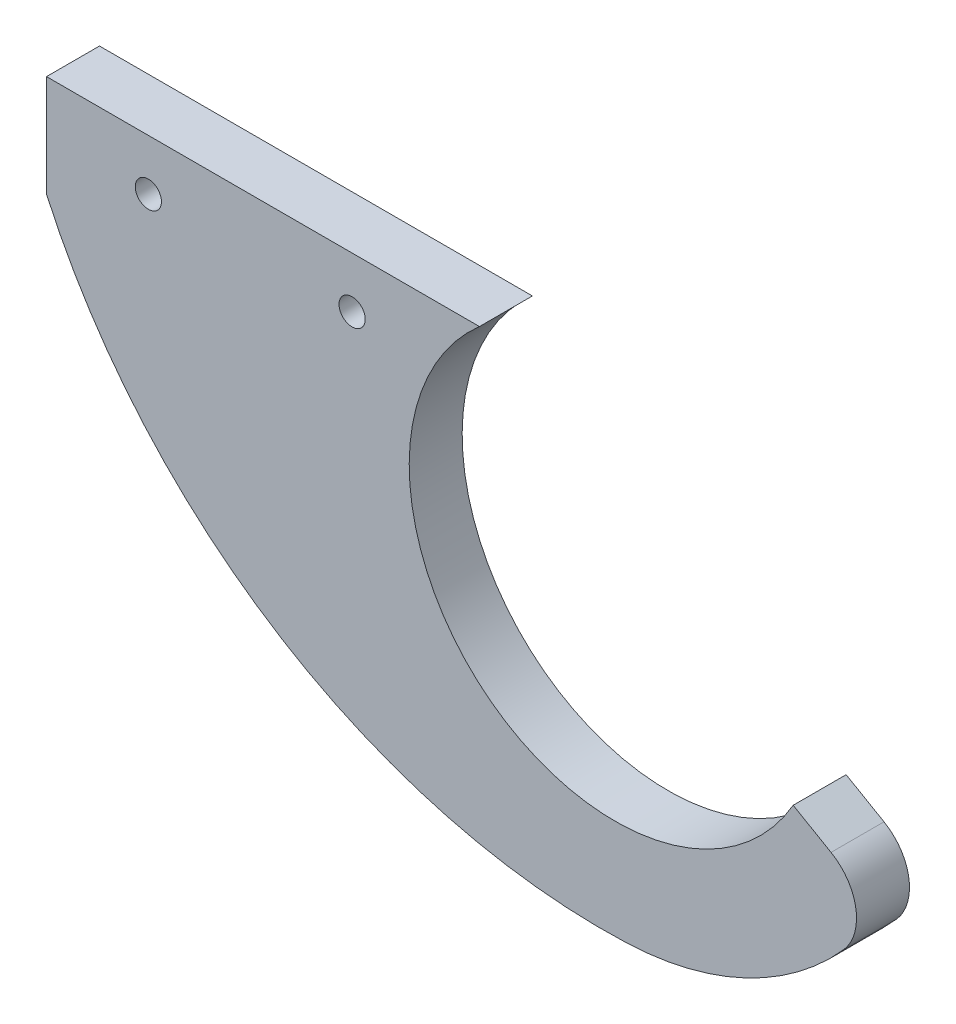
ISO-10303-21;
HEADER;
FILE_DESCRIPTION(('STEP AP214'),'2;1');
FILE_NAME('part.step','',(''),(''),'','','');
FILE_SCHEMA(('AUTOMOTIVE_DESIGN { 1 0 10303 214 1 1 1 1 }'));
ENDSEC;
DATA;
#1=APPLICATION_CONTEXT('core data for automotive mechanical design processes');
#2=APPLICATION_PROTOCOL_DEFINITION('international standard','automotive_design',2000,#1);
#3=PRODUCT_CONTEXT('',#1,'mechanical');
#4=PRODUCT('Part','Part','',(#3));
#5=PRODUCT_RELATED_PRODUCT_CATEGORY('part','',(#4));
#6=PRODUCT_DEFINITION_FORMATION('','',#4);
#7=PRODUCT_DEFINITION_CONTEXT('part definition',#1,'design');
#8=PRODUCT_DEFINITION('design','',#6,#7);
#9=PRODUCT_DEFINITION_SHAPE('','',#8);
#10=(LENGTH_UNIT() NAMED_UNIT(*) SI_UNIT(.MILLI.,.METRE.));
#11=(NAMED_UNIT(*) PLANE_ANGLE_UNIT() SI_UNIT($,.RADIAN.));
#12=(NAMED_UNIT(*) SI_UNIT($,.STERADIAN.) SOLID_ANGLE_UNIT());
#13=UNCERTAINTY_MEASURE_WITH_UNIT(LENGTH_MEASURE(1.E-05),#10,'distance_accuracy_value','');
#14=(GEOMETRIC_REPRESENTATION_CONTEXT(3) GLOBAL_UNCERTAINTY_ASSIGNED_CONTEXT((#13)) GLOBAL_UNIT_ASSIGNED_CONTEXT((#10,
#11,#12)) REPRESENTATION_CONTEXT('',''));
#15=CARTESIAN_POINT('',(0.,0.,0.));
#16=DIRECTION('',(0.,0.,1.));
#17=DIRECTION('',(1.,0.,0.));
#18=AXIS2_PLACEMENT_3D('',#15,#16,#17);
#19=CARTESIAN_POINT('',(-53.975,0.,6.604));
#20=DIRECTION('',(1.,0.,0.));
#21=DIRECTION('',(0.,0.,-1.));
#22=AXIS2_PLACEMENT_3D('',#19,#20,#21);
#23=PLANE('',#22);
#24=DIRECTION('',(0.,-1.,0.));
#25=VECTOR('',#24,1.);
#26=CARTESIAN_POINT('',(-53.975,0.,0.));
#27=LINE('',#26,#25);
#28=CARTESIAN_POINT('',(-53.975,-5.08,0.));
#29=VERTEX_POINT('',#28);
#30=CARTESIAN_POINT('',(-53.975,-17.78,0.));
#31=VERTEX_POINT('',#30);
#32=EDGE_CURVE('E118',#29,#31,#27,.T.);
#33=ORIENTED_EDGE('',*,*,#32,.T.);
#34=DIRECTION('',(0.,0.,-1.));
#35=VECTOR('',#34,1.);
#36=CARTESIAN_POINT('',(-53.975,-17.78,6.604));
#37=LINE('',#36,#35);
#38=CARTESIAN_POINT('',(-53.975,-17.78,6.604));
#39=VERTEX_POINT('',#38);
#40=EDGE_CURVE('E101',#39,#31,#37,.T.);
#41=ORIENTED_EDGE('',*,*,#40,.F.);
#42=DIRECTION('',(0.,-1.,0.));
#43=VECTOR('',#42,1.);
#44=CARTESIAN_POINT('',(-53.975,0.,6.604));
#45=LINE('',#44,#43);
#46=CARTESIAN_POINT('',(-53.975,-5.08,6.604));
#47=VERTEX_POINT('',#46);
#48=EDGE_CURVE('E107',#47,#39,#45,.T.);
#49=ORIENTED_EDGE('',*,*,#48,.F.);
#50=DIRECTION('',(0.,0.,-1.));
#51=VECTOR('',#50,1.);
#52=CARTESIAN_POINT('',(-53.975,-5.08,6.604));
#53=LINE('',#52,#51);
#54=EDGE_CURVE('E131',#47,#29,#53,.T.);
#55=ORIENTED_EDGE('',*,*,#54,.T.);
#56=EDGE_LOOP('',(#33,#41,#49,#55));
#57=FACE_BOUND('',#56,.T.);
#58=ADVANCED_FACE('F37',(#57),#23,.F.);
#59=CARTESIAN_POINT('',(15.4240882366703,13.6875475993736,6.604));
#60=DIRECTION('',(0.,0.,-1.));
#61=DIRECTION('',(-1.,0.,0.));
#62=AXIS2_PLACEMENT_3D('',#59,#60,#61);
#63=CYLINDRICAL_SURFACE('',#62,76.2);
#64=CARTESIAN_POINT('',(15.4240882366703,13.6875475993736,0.));
#65=DIRECTION('',(0.,0.,1.));
#66=DIRECTION('',(1.,0.,0.));
#67=AXIS2_PLACEMENT_3D('',#64,#65,#66);
#68=CIRCLE('',#67,76.2);
#69=CARTESIAN_POINT('',(18.3684138902809,-62.4555475993736,0.));
#70=VERTEX_POINT('',#69);
#71=EDGE_CURVE('E142',#31,#70,#68,.T.);
#72=ORIENTED_EDGE('',*,*,#71,.T.);
#73=DIRECTION('',(0.,0.,-1.));
#74=VECTOR('',#73,1.);
#75=CARTESIAN_POINT('',(18.3684138902809,-62.4555475993736,6.604));
#76=LINE('',#75,#74);
#77=CARTESIAN_POINT('',(18.3684138902809,-62.4555475993736,6.604));
#78=VERTEX_POINT('',#77);
#79=EDGE_CURVE('E104',#78,#70,#76,.T.);
#80=ORIENTED_EDGE('',*,*,#79,.F.);
#81=CARTESIAN_POINT('',(15.4240882366703,13.6875475993736,6.604));
#82=DIRECTION('',(0.,0.,1.));
#83=DIRECTION('',(1.,0.,0.));
#84=AXIS2_PLACEMENT_3D('',#81,#82,#83);
#85=CIRCLE('',#84,76.2);
#86=EDGE_CURVE('E96',#39,#78,#85,.T.);
#87=ORIENTED_EDGE('',*,*,#86,.F.);
#88=ORIENTED_EDGE('',*,*,#40,.T.);
#89=EDGE_LOOP('',(#72,#80,#87,#88));
#90=FACE_BOUND('',#89,.T.);
#91=ADVANCED_FACE('F99',(#90),#63,.T.);
#92=CARTESIAN_POINT('',(16.8962510634756,-24.384,6.604));
#93=DIRECTION('',(0.,0.,-1.));
#94=DIRECTION('',(-1.,0.,0.));
#95=AXIS2_PLACEMENT_3D('',#92,#93,#94);
#96=CYLINDRICAL_SURFACE('',#95,38.1);
#97=CARTESIAN_POINT('',(16.8962510634756,-24.384,0.));
#98=DIRECTION('',(0.,0.,1.));
#99=DIRECTION('',(1.,0.,0.));
#100=AXIS2_PLACEMENT_3D('',#97,#98,#99);
#101=CIRCLE('',#100,38.1);
#102=CARTESIAN_POINT('',(45.4151730993247,-49.6482254168451,0.));
#103=VERTEX_POINT('',#102);
#104=EDGE_CURVE('E140',#103,#70,#101,.F.);
#105=ORIENTED_EDGE('',*,*,#104,.F.);
#106=DIRECTION('',(0.,0.,-1.));
#107=VECTOR('',#106,1.);
#108=CARTESIAN_POINT('',(45.4151730993247,-49.6482254168451,6.604));
#109=LINE('',#108,#107);
#110=CARTESIAN_POINT('',(45.4151730993247,-49.6482254168451,6.604));
#111=VERTEX_POINT('',#110);
#112=EDGE_CURVE('E46',#103,#111,#109,.F.);
#113=ORIENTED_EDGE('',*,*,#112,.T.);
#114=CARTESIAN_POINT('',(16.8962510634756,-24.384,6.604));
#115=DIRECTION('',(0.,0.,1.));
#116=DIRECTION('',(1.,0.,0.));
#117=AXIS2_PLACEMENT_3D('',#114,#115,#116);
#118=CIRCLE('',#117,38.1);
#119=EDGE_CURVE('E106',#111,#78,#118,.F.);
#120=ORIENTED_EDGE('',*,*,#119,.T.);
#121=ORIENTED_EDGE('',*,*,#79,.T.);
#122=EDGE_LOOP('',(#105,#113,#120,#121));
#123=FACE_BOUND('',#122,.T.);
#124=ADVANCED_FACE('F191',(#123),#96,.T.);
#125=CARTESIAN_POINT('',(-6.334518957071,-10.9717086751553,6.604));
#126=DIRECTION('',(0.499999999999994,0.866025403784442,0.));
#127=DIRECTION('',(-0.866025403784442,0.499999999999994,0.));
#128=AXIS2_PLACEMENT_3D('',#125,#126,#127);
#129=PLANE('',#128);
#130=DIRECTION('',(0.866025403784442,-0.499999999999994,0.));
#131=VECTOR('',#130,1.);
#132=CARTESIAN_POINT('',(-6.334518957071,-10.9717086751553,6.604));
#133=LINE('',#132,#131);
#134=CARTESIAN_POINT('',(39.1132667721617,-37.2109999999999,6.604));
#135=VERTEX_POINT('',#134);
#136=CARTESIAN_POINT('',(43.8370194266831,-39.938259866673,6.604));
#137=VERTEX_POINT('',#136);
#138=EDGE_CURVE('E148',#135,#137,#133,.T.);
#139=ORIENTED_EDGE('',*,*,#138,.T.);
#140=DIRECTION('',(0.,0.,-1.));
#141=VECTOR('',#140,1.);
#142=CARTESIAN_POINT('',(43.8370194266831,-39.938259866673,6.604));
#143=LINE('',#142,#141);
#144=CARTESIAN_POINT('',(43.8370194266831,-39.938259866673,0.));
#145=VERTEX_POINT('',#144);
#146=EDGE_CURVE('E119',#137,#145,#143,.T.);
#147=ORIENTED_EDGE('',*,*,#146,.T.);
#148=DIRECTION('',(0.866025403784442,-0.499999999999994,0.));
#149=VECTOR('',#148,1.);
#150=CARTESIAN_POINT('',(-6.334518957071,-10.9717086751553,0.));
#151=LINE('',#150,#149);
#152=CARTESIAN_POINT('',(39.1132667721617,-37.2109999999999,0.));
#153=VERTEX_POINT('',#152);
#154=EDGE_CURVE('E138',#153,#145,#151,.T.);
#155=ORIENTED_EDGE('',*,*,#154,.F.);
#156=DIRECTION('',(0.,0.,-1.));
#157=VECTOR('',#156,1.);
#158=CARTESIAN_POINT('',(39.1132667721617,-37.2109999999999,6.604));
#159=LINE('',#158,#157);
#160=EDGE_CURVE('E123',#135,#153,#159,.T.);
#161=ORIENTED_EDGE('',*,*,#160,.F.);
#162=EDGE_LOOP('',(#139,#147,#155,#161));
#163=FACE_BOUND('',#162,.T.);
#164=ADVANCED_FACE('F185',(#163),#129,.T.);
#165=CARTESIAN_POINT('',(16.8962510634756,-24.384,6.604));
#166=DIRECTION('',(0.,0.,-1.));
#167=DIRECTION('',(-1.,0.,0.));
#168=AXIS2_PLACEMENT_3D('',#165,#166,#167);
#169=CYLINDRICAL_SURFACE('',#168,25.654);
#170=CARTESIAN_POINT('',(16.8962510634756,-24.384,0.));
#171=DIRECTION('',(0.,0.,1.));
#172=DIRECTION('',(1.,0.,0.));
#173=AXIS2_PLACEMENT_3D('',#170,#171,#172);
#174=CIRCLE('',#173,25.654);
#175=CARTESIAN_POINT('',(0.,-5.08,0.));
#176=VERTEX_POINT('',#175);
#177=EDGE_CURVE('E135',#153,#176,#174,.F.);
#178=ORIENTED_EDGE('',*,*,#177,.T.);
#179=DIRECTION('',(0.,0.,-1.));
#180=VECTOR('',#179,1.);
#181=CARTESIAN_POINT('',(0.,-5.08,6.604));
#182=LINE('',#181,#180);
#183=CARTESIAN_POINT('',(0.,-5.08,6.604));
#184=VERTEX_POINT('',#183);
#185=EDGE_CURVE('E129',#184,#176,#182,.T.);
#186=ORIENTED_EDGE('',*,*,#185,.F.);
#187=CARTESIAN_POINT('',(16.8962510634756,-24.384,6.604));
#188=DIRECTION('',(0.,0.,1.));
#189=DIRECTION('',(1.,0.,0.));
#190=AXIS2_PLACEMENT_3D('',#187,#188,#189);
#191=CIRCLE('',#190,25.654);
#192=EDGE_CURVE('E146',#135,#184,#191,.F.);
#193=ORIENTED_EDGE('',*,*,#192,.F.);
#194=ORIENTED_EDGE('',*,*,#160,.T.);
#195=EDGE_LOOP('',(#178,#186,#193,#194));
#196=FACE_BOUND('',#195,.T.);
#197=ADVANCED_FACE('F196',(#196),#169,.F.);
#198=CARTESIAN_POINT('',(0.,-5.08,6.604));
#199=DIRECTION('',(0.,1.,0.));
#200=DIRECTION('',(0.,0.,1.));
#201=AXIS2_PLACEMENT_3D('',#198,#199,#200);
#202=PLANE('',#201);
#203=DIRECTION('',(1.,0.,0.));
#204=VECTOR('',#203,1.);
#205=CARTESIAN_POINT('',(0.,-5.08,0.));
#206=LINE('',#205,#204);
#207=EDGE_CURVE('E115',#29,#176,#206,.T.);
#208=ORIENTED_EDGE('',*,*,#207,.F.);
#209=ORIENTED_EDGE('',*,*,#54,.F.);
#210=DIRECTION('',(1.,0.,0.));
#211=VECTOR('',#210,1.);
#212=CARTESIAN_POINT('',(0.,-5.08,6.604));
#213=LINE('',#212,#211);
#214=EDGE_CURVE('E113',#47,#184,#213,.T.);
#215=ORIENTED_EDGE('',*,*,#214,.T.);
#216=ORIENTED_EDGE('',*,*,#185,.T.);
#217=EDGE_LOOP('',(#208,#209,#215,#216));
#218=FACE_BOUND('',#217,.T.);
#219=ADVANCED_FACE('F168',(#218),#202,.T.);
#220=CARTESIAN_POINT('',(0.,0.,6.604));
#221=DIRECTION('',(0.,0.,1.));
#222=DIRECTION('',(1.,0.,0.));
#223=AXIS2_PLACEMENT_3D('',#220,#221,#222);
#224=PLANE('',#223);
#225=CARTESIAN_POINT('',(-15.875,-11.43,6.604));
#226=DIRECTION('',(0.,0.,1.));
#227=DIRECTION('',(1.,0.,0.));
#228=AXIS2_PLACEMENT_3D('',#225,#226,#227);
#229=CIRCLE('',#228,1.63194999999999);
#230=CARTESIAN_POINT('',(-14.24305,-11.43,6.604));
#231=VERTEX_POINT('',#230);
#232=EDGE_CURVE('E158',#231,#231,#229,.T.);
#233=ORIENTED_EDGE('',*,*,#232,.F.);
#234=EDGE_LOOP('',(#233));
#235=FACE_BOUND('',#234,.T.);
#236=CARTESIAN_POINT('',(-41.275,-11.43,6.604));
#237=DIRECTION('',(0.,0.,1.));
#238=DIRECTION('',(1.,0.,0.));
#239=AXIS2_PLACEMENT_3D('',#236,#237,#238);
#240=CIRCLE('',#239,1.63194999999999);
#241=CARTESIAN_POINT('',(-39.64305,-11.43,6.604));
#242=VERTEX_POINT('',#241);
#243=EDGE_CURVE('E152',#242,#242,#240,.T.);
#244=ORIENTED_EDGE('',*,*,#243,.F.);
#245=EDGE_LOOP('',(#244));
#246=FACE_BOUND('',#245,.T.);
#247=ORIENTED_EDGE('',*,*,#119,.F.);
#248=CARTESIAN_POINT('',(40.6620194266832,-45.4375211807042,6.604));
#249=DIRECTION('',(0.,0.,1.));
#250=DIRECTION('',(1.,0.,0.));
#251=AXIS2_PLACEMENT_3D('',#248,#249,#250);
#252=CIRCLE('',#251,6.35);
#253=EDGE_CURVE('E11',#111,#137,#252,.T.);
#254=ORIENTED_EDGE('',*,*,#253,.T.);
#255=ORIENTED_EDGE('',*,*,#138,.F.);
#256=ORIENTED_EDGE('',*,*,#192,.T.);
#257=ORIENTED_EDGE('',*,*,#214,.F.);
#258=ORIENTED_EDGE('',*,*,#48,.T.);
#259=ORIENTED_EDGE('',*,*,#86,.T.);
#260=EDGE_LOOP('',(#247,#254,#255,#256,#257,#258,#259));
#261=FACE_BOUND('',#260,.T.);
#262=ADVANCED_FACE('F111',(#235,#246,#261),#224,.T.);
#263=CARTESIAN_POINT('',(0.,0.,0.));
#264=DIRECTION('',(0.,0.,1.));
#265=DIRECTION('',(1.,0.,0.));
#266=AXIS2_PLACEMENT_3D('',#263,#264,#265);
#267=PLANE('',#266);
#268=CARTESIAN_POINT('',(-15.875,-11.43,0.));
#269=DIRECTION('',(0.,0.,1.));
#270=DIRECTION('',(1.,0.,0.));
#271=AXIS2_PLACEMENT_3D('',#268,#269,#270);
#272=CIRCLE('',#271,1.63194999999999);
#273=CARTESIAN_POINT('',(-14.24305,-11.43,0.));
#274=VERTEX_POINT('',#273);
#275=EDGE_CURVE('E155',#274,#274,#272,.T.);
#276=ORIENTED_EDGE('',*,*,#275,.T.);
#277=EDGE_LOOP('',(#276));
#278=FACE_BOUND('',#277,.T.);
#279=CARTESIAN_POINT('',(-41.275,-11.43,0.));
#280=DIRECTION('',(0.,0.,1.));
#281=DIRECTION('',(1.,0.,0.));
#282=AXIS2_PLACEMENT_3D('',#279,#280,#281);
#283=CIRCLE('',#282,1.63194999999999);
#284=CARTESIAN_POINT('',(-39.64305,-11.43,0.));
#285=VERTEX_POINT('',#284);
#286=EDGE_CURVE('E41',#285,#285,#283,.T.);
#287=ORIENTED_EDGE('',*,*,#286,.T.);
#288=EDGE_LOOP('',(#287));
#289=FACE_BOUND('',#288,.T.);
#290=ORIENTED_EDGE('',*,*,#154,.T.);
#291=CARTESIAN_POINT('',(40.6620194266832,-45.4375211807042,0.));
#292=DIRECTION('',(0.,0.,1.));
#293=DIRECTION('',(1.,0.,0.));
#294=AXIS2_PLACEMENT_3D('',#291,#292,#293);
#295=CIRCLE('',#294,6.35);
#296=EDGE_CURVE('E60',#145,#103,#295,.F.);
#297=ORIENTED_EDGE('',*,*,#296,.T.);
#298=ORIENTED_EDGE('',*,*,#104,.T.);
#299=ORIENTED_EDGE('',*,*,#71,.F.);
#300=ORIENTED_EDGE('',*,*,#32,.F.);
#301=ORIENTED_EDGE('',*,*,#207,.T.);
#302=ORIENTED_EDGE('',*,*,#177,.F.);
#303=EDGE_LOOP('',(#290,#297,#298,#299,#300,#301,#302));
#304=FACE_BOUND('',#303,.T.);
#305=ADVANCED_FACE('F167',(#278,#289,#304),#267,.F.);
#306=CARTESIAN_POINT('',(40.6620194266832,-45.4375211807042,6.604));
#307=DIRECTION('',(0.,0.,-1.));
#308=DIRECTION('',(-1.,0.,0.));
#309=AXIS2_PLACEMENT_3D('',#306,#307,#308);
#310=CYLINDRICAL_SURFACE('',#309,6.35);
#311=ORIENTED_EDGE('',*,*,#253,.F.);
#312=ORIENTED_EDGE('',*,*,#112,.F.);
#313=ORIENTED_EDGE('',*,*,#296,.F.);
#314=ORIENTED_EDGE('',*,*,#146,.F.);
#315=EDGE_LOOP('',(#311,#312,#313,#314));
#316=FACE_BOUND('',#315,.T.);
#317=ADVANCED_FACE('F39',(#316),#310,.T.);
#318=CARTESIAN_POINT('',(-41.275,-11.43,6.604));
#319=DIRECTION('',(0.,0.,1.));
#320=DIRECTION('',(1.,0.,0.));
#321=AXIS2_PLACEMENT_3D('',#318,#319,#320);
#322=CYLINDRICAL_SURFACE('',#321,1.63194999999999);
#323=ORIENTED_EDGE('',*,*,#243,.T.);
#324=EDGE_LOOP('',(#323));
#325=FACE_BOUND('',#324,.T.);
#326=ORIENTED_EDGE('',*,*,#286,.F.);
#327=EDGE_LOOP('',(#326));
#328=FACE_BOUND('',#327,.T.);
#329=ADVANCED_FACE('F172',(#325,#328),#322,.F.);
#330=CARTESIAN_POINT('',(-15.875,-11.43,6.604));
#331=DIRECTION('',(0.,0.,1.));
#332=DIRECTION('',(1.,0.,0.));
#333=AXIS2_PLACEMENT_3D('',#330,#331,#332);
#334=CYLINDRICAL_SURFACE('',#333,1.63194999999999);
#335=ORIENTED_EDGE('',*,*,#232,.T.);
#336=EDGE_LOOP('',(#335));
#337=FACE_BOUND('',#336,.T.);
#338=ORIENTED_EDGE('',*,*,#275,.F.);
#339=EDGE_LOOP('',(#338));
#340=FACE_BOUND('',#339,.T.);
#341=ADVANCED_FACE('F162',(#337,#340),#334,.F.);
#342=CLOSED_SHELL('',(#58,#91,#124,#164,#197,#219,#262,#305,#317,#329,#341));
#343=MANIFOLD_SOLID_BREP('B2',#342);
#344=ADVANCED_BREP_SHAPE_REPRESENTATION('',(#18,#343),#14);
#345=SHAPE_DEFINITION_REPRESENTATION(#9,#344);
ENDSEC;
END-ISO-10303-21;
